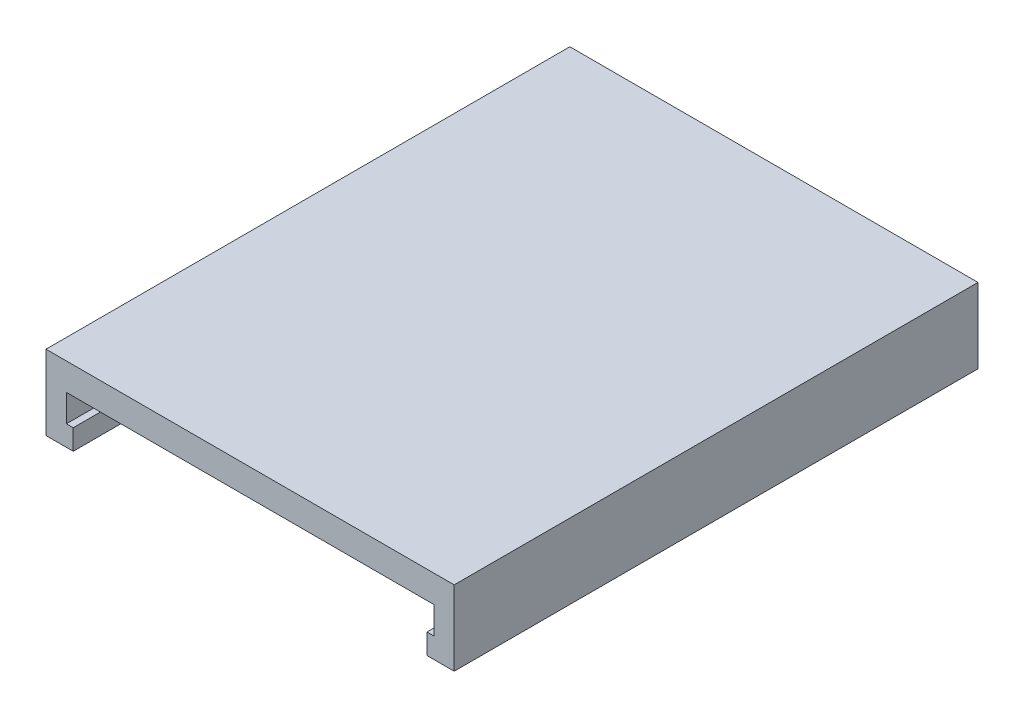
ISO-10303-21;
HEADER;
FILE_DESCRIPTION(('STEP AP214'),'2;1');
FILE_NAME('part.step','',(''),(''),'','','');
FILE_SCHEMA(('AUTOMOTIVE_DESIGN { 1 0 10303 214 1 1 1 1 }'));
ENDSEC;
DATA;
#1=APPLICATION_CONTEXT('core data for automotive mechanical design processes');
#2=APPLICATION_PROTOCOL_DEFINITION('international standard','automotive_design',2000,#1);
#3=PRODUCT_CONTEXT('',#1,'mechanical');
#4=PRODUCT('Part','Part','',(#3));
#5=PRODUCT_RELATED_PRODUCT_CATEGORY('part','',(#4));
#6=PRODUCT_DEFINITION_FORMATION('','',#4);
#7=PRODUCT_DEFINITION_CONTEXT('part definition',#1,'design');
#8=PRODUCT_DEFINITION('design','',#6,#7);
#9=PRODUCT_DEFINITION_SHAPE('','',#8);
#10=(LENGTH_UNIT() NAMED_UNIT(*) SI_UNIT(.MILLI.,.METRE.));
#11=(NAMED_UNIT(*) PLANE_ANGLE_UNIT() SI_UNIT($,.RADIAN.));
#12=(NAMED_UNIT(*) SI_UNIT($,.STERADIAN.) SOLID_ANGLE_UNIT());
#13=UNCERTAINTY_MEASURE_WITH_UNIT(LENGTH_MEASURE(1.E-05),#10,'distance_accuracy_value','');
#14=(GEOMETRIC_REPRESENTATION_CONTEXT(3) GLOBAL_UNCERTAINTY_ASSIGNED_CONTEXT((#13)) GLOBAL_UNIT_ASSIGNED_CONTEXT((#10,
#11,#12)) REPRESENTATION_CONTEXT('',''));
#15=CARTESIAN_POINT('',(0.,0.,0.));
#16=DIRECTION('',(0.,0.,1.));
#17=DIRECTION('',(1.,0.,0.));
#18=AXIS2_PLACEMENT_3D('',#15,#16,#17);
#19=CARTESIAN_POINT('',(57.,0.,72.));
#20=DIRECTION('',(-1.,0.,0.));
#21=DIRECTION('',(0.,0.,1.));
#22=AXIS2_PLACEMENT_3D('',#19,#20,#21);
#23=PLANE('',#22);
#24=DIRECTION('',(0.,0.,1.));
#25=VECTOR('',#24,1.);
#26=CARTESIAN_POINT('',(57.,-3.,0.));
#27=LINE('',#26,#25);
#28=CARTESIAN_POINT('',(57.,-3.,-5.));
#29=VERTEX_POINT('',#28);
#30=CARTESIAN_POINT('',(57.,-3.,72.));
#31=VERTEX_POINT('',#30);
#32=EDGE_CURVE('E131',#29,#31,#27,.T.);
#33=ORIENTED_EDGE('',*,*,#32,.F.);
#34=DIRECTION('',(0.,-1.,0.));
#35=VECTOR('',#34,1.);
#36=CARTESIAN_POINT('',(57.,8.,-5.));
#37=LINE('',#36,#35);
#38=CARTESIAN_POINT('',(57.,8.,-5.));
#39=VERTEX_POINT('',#38);
#40=EDGE_CURVE('E135',#39,#29,#37,.T.);
#41=ORIENTED_EDGE('',*,*,#40,.F.);
#42=DIRECTION('',(0.,0.,-1.));
#43=VECTOR('',#42,1.);
#44=CARTESIAN_POINT('',(57.,8.,72.));
#45=LINE('',#44,#43);
#46=CARTESIAN_POINT('',(57.,8.,72.));
#47=VERTEX_POINT('',#46);
#48=EDGE_CURVE('E11',#47,#39,#45,.T.);
#49=ORIENTED_EDGE('',*,*,#48,.F.);
#50=DIRECTION('',(0.,1.,0.));
#51=VECTOR('',#50,1.);
#52=CARTESIAN_POINT('',(57.,0.,72.));
#53=LINE('',#52,#51);
#54=EDGE_CURVE('E136',#31,#47,#53,.T.);
#55=ORIENTED_EDGE('',*,*,#54,.F.);
#56=EDGE_LOOP('',(#33,#41,#49,#55));
#57=FACE_BOUND('',#56,.T.);
#58=ADVANCED_FACE('F41',(#57),#23,.F.);
#59=CARTESIAN_POINT('',(0.,8.,72.));
#60=DIRECTION('',(0.,1.,0.));
#61=DIRECTION('',(0.,0.,1.));
#62=AXIS2_PLACEMENT_3D('',#59,#60,#61);
#63=PLANE('',#62);
#64=ORIENTED_EDGE('',*,*,#48,.T.);
#65=DIRECTION('',(1.,0.,0.));
#66=VECTOR('',#65,1.);
#67=CARTESIAN_POINT('',(57.,8.,-5.));
#68=LINE('',#67,#66);
#69=CARTESIAN_POINT('',(-3.,8.,-5.));
#70=VERTEX_POINT('',#69);
#71=EDGE_CURVE('E158',#70,#39,#68,.T.);
#72=ORIENTED_EDGE('',*,*,#71,.F.);
#73=DIRECTION('',(0.,0.,-1.));
#74=VECTOR('',#73,1.);
#75=CARTESIAN_POINT('',(-3.,8.,72.));
#76=LINE('',#75,#74);
#77=CARTESIAN_POINT('',(-3.,8.,72.));
#78=VERTEX_POINT('',#77);
#79=EDGE_CURVE('E49',#78,#70,#76,.T.);
#80=ORIENTED_EDGE('',*,*,#79,.F.);
#81=DIRECTION('',(1.,0.,0.));
#82=VECTOR('',#81,1.);
#83=CARTESIAN_POINT('',(0.,8.,72.));
#84=LINE('',#83,#82);
#85=EDGE_CURVE('E221',#78,#47,#84,.T.);
#86=ORIENTED_EDGE('',*,*,#85,.T.);
#87=EDGE_LOOP('',(#64,#72,#80,#86));
#88=FACE_BOUND('',#87,.T.);
#89=ADVANCED_FACE('F265',(#88),#63,.T.);
#90=CARTESIAN_POINT('',(-3.,0.,72.));
#91=DIRECTION('',(-1.,0.,0.));
#92=DIRECTION('',(0.,0.,1.));
#93=AXIS2_PLACEMENT_3D('',#90,#91,#92);
#94=PLANE('',#93);
#95=ORIENTED_EDGE('',*,*,#79,.T.);
#96=DIRECTION('',(0.,1.,0.));
#97=VECTOR('',#96,1.);
#98=CARTESIAN_POINT('',(-3.,8.,-5.));
#99=LINE('',#98,#97);
#100=CARTESIAN_POINT('',(-3.,-3.,-5.));
#101=VERTEX_POINT('',#100);
#102=EDGE_CURVE('E153',#101,#70,#99,.T.);
#103=ORIENTED_EDGE('',*,*,#102,.F.);
#104=DIRECTION('',(0.,0.,-1.));
#105=VECTOR('',#104,1.);
#106=CARTESIAN_POINT('',(-3.,-3.,72.));
#107=LINE('',#106,#105);
#108=CARTESIAN_POINT('',(-3.,-3.,72.));
#109=VERTEX_POINT('',#108);
#110=EDGE_CURVE('E148',#109,#101,#107,.T.);
#111=ORIENTED_EDGE('',*,*,#110,.F.);
#112=DIRECTION('',(0.,1.,0.));
#113=VECTOR('',#112,1.);
#114=CARTESIAN_POINT('',(-3.,0.,72.));
#115=LINE('',#114,#113);
#116=EDGE_CURVE('E226',#109,#78,#115,.T.);
#117=ORIENTED_EDGE('',*,*,#116,.T.);
#118=EDGE_LOOP('',(#95,#103,#111,#117));
#119=FACE_BOUND('',#118,.T.);
#120=ADVANCED_FACE('F262',(#119),#94,.T.);
#121=CARTESIAN_POINT('',(0.,0.,72.));
#122=DIRECTION('',(-1.,0.,0.));
#123=DIRECTION('',(0.,0.,1.));
#124=AXIS2_PLACEMENT_3D('',#121,#122,#123);
#125=PLANE('',#124);
#126=DIRECTION('',(0.,1.,0.));
#127=VECTOR('',#126,1.);
#128=CARTESIAN_POINT('',(0.,0.,0.));
#129=LINE('',#128,#127);
#130=CARTESIAN_POINT('',(0.,0.,0.));
#131=VERTEX_POINT('',#130);
#132=CARTESIAN_POINT('',(0.,4.,0.));
#133=VERTEX_POINT('',#132);
#134=EDGE_CURVE('E218',#131,#133,#129,.T.);
#135=ORIENTED_EDGE('',*,*,#134,.T.);
#136=DIRECTION('',(0.,0.,-1.));
#137=VECTOR('',#136,1.);
#138=CARTESIAN_POINT('',(0.,4.,72.));
#139=LINE('',#138,#137);
#140=CARTESIAN_POINT('',(0.,4.,72.));
#141=VERTEX_POINT('',#140);
#142=EDGE_CURVE('E253',#141,#133,#139,.T.);
#143=ORIENTED_EDGE('',*,*,#142,.F.);
#144=DIRECTION('',(0.,1.,0.));
#145=VECTOR('',#144,1.);
#146=CARTESIAN_POINT('',(0.,0.,72.));
#147=LINE('',#146,#145);
#148=CARTESIAN_POINT('',(0.,0.,72.));
#149=VERTEX_POINT('',#148);
#150=EDGE_CURVE('E230',#149,#141,#147,.T.);
#151=ORIENTED_EDGE('',*,*,#150,.F.);
#152=DIRECTION('',(0.,0.,-1.));
#153=VECTOR('',#152,1.);
#154=CARTESIAN_POINT('',(0.,0.,72.));
#155=LINE('',#154,#153);
#156=EDGE_CURVE('E257',#149,#131,#155,.T.);
#157=ORIENTED_EDGE('',*,*,#156,.T.);
#158=EDGE_LOOP('',(#135,#143,#151,#157));
#159=FACE_BOUND('',#158,.T.);
#160=ADVANCED_FACE('F289',(#159),#125,.F.);
#161=CARTESIAN_POINT('',(0.,4.,72.));
#162=DIRECTION('',(0.,1.,0.));
#163=DIRECTION('',(0.,0.,1.));
#164=AXIS2_PLACEMENT_3D('',#161,#162,#163);
#165=PLANE('',#164);
#166=DIRECTION('',(1.,0.,0.));
#167=VECTOR('',#166,1.);
#168=CARTESIAN_POINT('',(0.,4.,0.));
#169=LINE('',#168,#167);
#170=CARTESIAN_POINT('',(54.,4.,0.));
#171=VERTEX_POINT('',#170);
#172=EDGE_CURVE('E241',#133,#171,#169,.T.);
#173=ORIENTED_EDGE('',*,*,#172,.T.);
#174=DIRECTION('',(0.,0.,-1.));
#175=VECTOR('',#174,1.);
#176=CARTESIAN_POINT('',(54.,4.,72.));
#177=LINE('',#176,#175);
#178=CARTESIAN_POINT('',(54.,4.,72.));
#179=VERTEX_POINT('',#178);
#180=EDGE_CURVE('E249',#179,#171,#177,.T.);
#181=ORIENTED_EDGE('',*,*,#180,.F.);
#182=DIRECTION('',(1.,0.,0.));
#183=VECTOR('',#182,1.);
#184=CARTESIAN_POINT('',(0.,4.,72.));
#185=LINE('',#184,#183);
#186=EDGE_CURVE('E63',#141,#179,#185,.T.);
#187=ORIENTED_EDGE('',*,*,#186,.F.);
#188=ORIENTED_EDGE('',*,*,#142,.T.);
#189=EDGE_LOOP('',(#173,#181,#187,#188));
#190=FACE_BOUND('',#189,.T.);
#191=ADVANCED_FACE('F291',(#190),#165,.F.);
#192=CARTESIAN_POINT('',(54.,0.,72.));
#193=DIRECTION('',(-1.,0.,0.));
#194=DIRECTION('',(0.,0.,1.));
#195=AXIS2_PLACEMENT_3D('',#192,#193,#194);
#196=PLANE('',#195);
#197=DIRECTION('',(0.,1.,0.));
#198=VECTOR('',#197,1.);
#199=CARTESIAN_POINT('',(54.,0.,0.));
#200=LINE('',#199,#198);
#201=CARTESIAN_POINT('',(54.,0.,0.));
#202=VERTEX_POINT('',#201);
#203=EDGE_CURVE('E222',#202,#171,#200,.T.);
#204=ORIENTED_EDGE('',*,*,#203,.F.);
#205=DIRECTION('',(0.,0.,-1.));
#206=VECTOR('',#205,1.);
#207=CARTESIAN_POINT('',(54.,0.,72.));
#208=LINE('',#207,#206);
#209=CARTESIAN_POINT('',(54.,0.,72.));
#210=VERTEX_POINT('',#209);
#211=EDGE_CURVE('E56',#210,#202,#208,.T.);
#212=ORIENTED_EDGE('',*,*,#211,.F.);
#213=DIRECTION('',(0.,1.,0.));
#214=VECTOR('',#213,1.);
#215=CARTESIAN_POINT('',(54.,0.,72.));
#216=LINE('',#215,#214);
#217=EDGE_CURVE('E235',#210,#179,#216,.T.);
#218=ORIENTED_EDGE('',*,*,#217,.T.);
#219=ORIENTED_EDGE('',*,*,#180,.T.);
#220=EDGE_LOOP('',(#204,#212,#218,#219));
#221=FACE_BOUND('',#220,.T.);
#222=ADVANCED_FACE('F292',(#221),#196,.T.);
#223=CARTESIAN_POINT('',(0.,0.,72.));
#224=DIRECTION('',(0.,0.,1.));
#225=DIRECTION('',(1.,0.,0.));
#226=AXIS2_PLACEMENT_3D('',#223,#224,#225);
#227=PLANE('',#226);
#228=ORIENTED_EDGE('',*,*,#217,.F.);
#229=DIRECTION('',(-1.,0.,0.));
#230=VECTOR('',#229,1.);
#231=CARTESIAN_POINT('',(57.,0.,72.));
#232=LINE('',#231,#230);
#233=CARTESIAN_POINT('',(53.,0.,72.));
#234=VERTEX_POINT('',#233);
#235=EDGE_CURVE('E169',#210,#234,#232,.T.);
#236=ORIENTED_EDGE('',*,*,#235,.T.);
#237=DIRECTION('',(0.,1.,0.));
#238=VECTOR('',#237,1.);
#239=CARTESIAN_POINT('',(53.,-3.,72.));
#240=LINE('',#239,#238);
#241=CARTESIAN_POINT('',(53.,-3.,72.));
#242=VERTEX_POINT('',#241);
#243=EDGE_CURVE('E188',#242,#234,#240,.T.);
#244=ORIENTED_EDGE('',*,*,#243,.F.);
#245=DIRECTION('',(-1.,0.,0.));
#246=VECTOR('',#245,1.);
#247=CARTESIAN_POINT('',(57.,-3.,72.));
#248=LINE('',#247,#246);
#249=EDGE_CURVE('E140',#31,#242,#248,.T.);
#250=ORIENTED_EDGE('',*,*,#249,.F.);
#251=ORIENTED_EDGE('',*,*,#54,.T.);
#252=ORIENTED_EDGE('',*,*,#85,.F.);
#253=ORIENTED_EDGE('',*,*,#116,.F.);
#254=DIRECTION('',(-1.,0.,0.));
#255=VECTOR('',#254,1.);
#256=CARTESIAN_POINT('',(-3.,-3.,72.));
#257=LINE('',#256,#255);
#258=CARTESIAN_POINT('',(1.,-3.,72.));
#259=VERTEX_POINT('',#258);
#260=EDGE_CURVE('E199',#259,#109,#257,.T.);
#261=ORIENTED_EDGE('',*,*,#260,.F.);
#262=DIRECTION('',(0.,1.,0.));
#263=VECTOR('',#262,1.);
#264=CARTESIAN_POINT('',(1.,-3.,72.));
#265=LINE('',#264,#263);
#266=CARTESIAN_POINT('',(1.,0.,72.));
#267=VERTEX_POINT('',#266);
#268=EDGE_CURVE('E202',#259,#267,#265,.T.);
#269=ORIENTED_EDGE('',*,*,#268,.T.);
#270=DIRECTION('',(-1.,0.,0.));
#271=VECTOR('',#270,1.);
#272=CARTESIAN_POINT('',(-3.,0.,72.));
#273=LINE('',#272,#271);
#274=EDGE_CURVE('E196',#267,#149,#273,.T.);
#275=ORIENTED_EDGE('',*,*,#274,.T.);
#276=ORIENTED_EDGE('',*,*,#150,.T.);
#277=ORIENTED_EDGE('',*,*,#186,.T.);
#278=EDGE_LOOP('',(#228,#236,#244,#250,#251,#252,#253,#261,#269,#275,#276,#277));
#279=FACE_BOUND('',#278,.T.);
#280=ADVANCED_FACE('F266',(#279),#227,.T.);
#281=CARTESIAN_POINT('',(0.,0.,0.));
#282=DIRECTION('',(0.,-1.,0.));
#283=DIRECTION('',(0.,0.,-1.));
#284=AXIS2_PLACEMENT_3D('',#281,#282,#283);
#285=PLANE('',#284);
#286=DIRECTION('',(1.,0.,0.));
#287=VECTOR('',#286,1.);
#288=CARTESIAN_POINT('',(-3.,0.,0.));
#289=LINE('',#288,#287);
#290=CARTESIAN_POINT('',(1.00000000000001,0.,0.));
#291=VERTEX_POINT('',#290);
#292=EDGE_CURVE('E192',#131,#291,#289,.T.);
#293=ORIENTED_EDGE('',*,*,#292,.F.);
#294=ORIENTED_EDGE('',*,*,#156,.F.);
#295=ORIENTED_EDGE('',*,*,#274,.F.);
#296=DIRECTION('',(0.,0.,1.));
#297=VECTOR('',#296,1.);
#298=CARTESIAN_POINT('',(1.,0.,72.));
#299=LINE('',#298,#297);
#300=EDGE_CURVE('E205',#291,#267,#299,.T.);
#301=ORIENTED_EDGE('',*,*,#300,.F.);
#302=EDGE_LOOP('',(#293,#294,#295,#301));
#303=FACE_BOUND('',#302,.T.);
#304=ADVANCED_FACE('F285',(#303),#285,.F.);
#305=CARTESIAN_POINT('',(1.,-3.,72.));
#306=DIRECTION('',(-1.,0.,0.));
#307=DIRECTION('',(0.,0.,1.));
#308=AXIS2_PLACEMENT_3D('',#305,#306,#307);
#309=PLANE('',#308);
#310=ORIENTED_EDGE('',*,*,#300,.T.);
#311=ORIENTED_EDGE('',*,*,#268,.F.);
#312=DIRECTION('',(0.,0.,1.));
#313=VECTOR('',#312,1.);
#314=CARTESIAN_POINT('',(1.,-3.,72.));
#315=LINE('',#314,#313);
#316=CARTESIAN_POINT('',(1.00000000000002,-3.,0.));
#317=VERTEX_POINT('',#316);
#318=EDGE_CURVE('E195',#317,#259,#315,.T.);
#319=ORIENTED_EDGE('',*,*,#318,.F.);
#320=DIRECTION('',(0.,1.,0.));
#321=VECTOR('',#320,1.);
#322=CARTESIAN_POINT('',(1.00000000000001,-3.,0.));
#323=LINE('',#322,#321);
#324=EDGE_CURVE('E214',#317,#291,#323,.T.);
#325=ORIENTED_EDGE('',*,*,#324,.T.);
#326=EDGE_LOOP('',(#310,#311,#319,#325));
#327=FACE_BOUND('',#326,.T.);
#328=ADVANCED_FACE('F281',(#327),#309,.F.);
#329=CARTESIAN_POINT('',(0.,-3.,0.));
#330=DIRECTION('',(0.,-1.,0.));
#331=DIRECTION('',(0.,0.,-1.));
#332=AXIS2_PLACEMENT_3D('',#329,#330,#331);
#333=PLANE('',#332);
#334=ORIENTED_EDGE('',*,*,#110,.T.);
#335=DIRECTION('',(-1.,0.,0.));
#336=VECTOR('',#335,1.);
#337=CARTESIAN_POINT('',(57.,-3.,-5.));
#338=LINE('',#337,#336);
#339=EDGE_CURVE('E144',#29,#101,#338,.T.);
#340=ORIENTED_EDGE('',*,*,#339,.F.);
#341=ORIENTED_EDGE('',*,*,#32,.T.);
#342=ORIENTED_EDGE('',*,*,#249,.T.);
#343=DIRECTION('',(0.,0.,-1.));
#344=VECTOR('',#343,1.);
#345=CARTESIAN_POINT('',(53.,-3.,0.));
#346=LINE('',#345,#344);
#347=CARTESIAN_POINT('',(53.,-3.,0.));
#348=VERTEX_POINT('',#347);
#349=EDGE_CURVE('E173',#242,#348,#346,.T.);
#350=ORIENTED_EDGE('',*,*,#349,.T.);
#351=DIRECTION('',(-1.,0.,0.));
#352=VECTOR('',#351,1.);
#353=CARTESIAN_POINT('',(57.,-3.,0.));
#354=LINE('',#353,#352);
#355=EDGE_CURVE('E160',#348,#317,#354,.T.);
#356=ORIENTED_EDGE('',*,*,#355,.T.);
#357=ORIENTED_EDGE('',*,*,#318,.T.);
#358=ORIENTED_EDGE('',*,*,#260,.T.);
#359=EDGE_LOOP('',(#334,#340,#341,#342,#350,#356,#357,#358));
#360=FACE_BOUND('',#359,.T.);
#361=ADVANCED_FACE('F145',(#360),#333,.T.);
#362=CARTESIAN_POINT('',(53.,-3.,0.));
#363=DIRECTION('',(1.,0.,0.));
#364=DIRECTION('',(0.,0.,-1.));
#365=AXIS2_PLACEMENT_3D('',#362,#363,#364);
#366=PLANE('',#365);
#367=DIRECTION('',(0.,0.,-1.));
#368=VECTOR('',#367,1.);
#369=CARTESIAN_POINT('',(53.,0.,0.));
#370=LINE('',#369,#368);
#371=CARTESIAN_POINT('',(53.,0.,0.));
#372=VERTEX_POINT('',#371);
#373=EDGE_CURVE('E180',#234,#372,#370,.T.);
#374=ORIENTED_EDGE('',*,*,#373,.T.);
#375=DIRECTION('',(0.,1.,0.));
#376=VECTOR('',#375,1.);
#377=CARTESIAN_POINT('',(53.,-3.,0.));
#378=LINE('',#377,#376);
#379=EDGE_CURVE('E177',#348,#372,#378,.T.);
#380=ORIENTED_EDGE('',*,*,#379,.F.);
#381=ORIENTED_EDGE('',*,*,#349,.F.);
#382=ORIENTED_EDGE('',*,*,#243,.T.);
#383=EDGE_LOOP('',(#374,#380,#381,#382));
#384=FACE_BOUND('',#383,.T.);
#385=ADVANCED_FACE('F273',(#384),#366,.F.);
#386=CARTESIAN_POINT('',(0.,0.,0.));
#387=DIRECTION('',(0.,-1.,0.));
#388=DIRECTION('',(0.,0.,-1.));
#389=AXIS2_PLACEMENT_3D('',#386,#387,#388);
#390=PLANE('',#389);
#391=ORIENTED_EDGE('',*,*,#211,.T.);
#392=DIRECTION('',(1.,0.,0.));
#393=VECTOR('',#392,1.);
#394=CARTESIAN_POINT('',(57.,0.,0.));
#395=LINE('',#394,#393);
#396=EDGE_CURVE('E141',#372,#202,#395,.T.);
#397=ORIENTED_EDGE('',*,*,#396,.F.);
#398=ORIENTED_EDGE('',*,*,#373,.F.);
#399=ORIENTED_EDGE('',*,*,#235,.F.);
#400=EDGE_LOOP('',(#391,#397,#398,#399));
#401=FACE_BOUND('',#400,.T.);
#402=ADVANCED_FACE('F295',(#401),#390,.F.);
#403=CARTESIAN_POINT('',(0.,0.,0.));
#404=DIRECTION('',(0.,0.,-1.));
#405=DIRECTION('',(-1.,0.,0.));
#406=AXIS2_PLACEMENT_3D('',#403,#404,#405);
#407=PLANE('',#406);
#408=ORIENTED_EDGE('',*,*,#355,.F.);
#409=ORIENTED_EDGE('',*,*,#379,.T.);
#410=ORIENTED_EDGE('',*,*,#396,.T.);
#411=ORIENTED_EDGE('',*,*,#203,.T.);
#412=ORIENTED_EDGE('',*,*,#172,.F.);
#413=ORIENTED_EDGE('',*,*,#134,.F.);
#414=ORIENTED_EDGE('',*,*,#292,.T.);
#415=ORIENTED_EDGE('',*,*,#324,.F.);
#416=EDGE_LOOP('',(#408,#409,#410,#411,#412,#413,#414,#415));
#417=FACE_BOUND('',#416,.T.);
#418=ADVANCED_FACE('F277',(#417),#407,.F.);
#419=CARTESIAN_POINT('',(0.,0.,-5.));
#420=DIRECTION('',(0.,0.,-1.));
#421=DIRECTION('',(-1.,0.,0.));
#422=AXIS2_PLACEMENT_3D('',#419,#420,#421);
#423=PLANE('',#422);
#424=ORIENTED_EDGE('',*,*,#40,.T.);
#425=ORIENTED_EDGE('',*,*,#339,.T.);
#426=ORIENTED_EDGE('',*,*,#102,.T.);
#427=ORIENTED_EDGE('',*,*,#71,.T.);
#428=EDGE_LOOP('',(#424,#425,#426,#427));
#429=FACE_BOUND('',#428,.T.);
#430=ADVANCED_FACE('F156',(#429),#423,.T.);
#431=CLOSED_SHELL('',(#58,#89,#120,#160,#191,#222,#280,#304,#328,#361,#385,#402,#418,#430));
#432=MANIFOLD_SOLID_BREP('B2',#431);
#433=ADVANCED_BREP_SHAPE_REPRESENTATION('',(#18,#432),#14);
#434=SHAPE_DEFINITION_REPRESENTATION(#9,#433);
ENDSEC;
END-ISO-10303-21;
